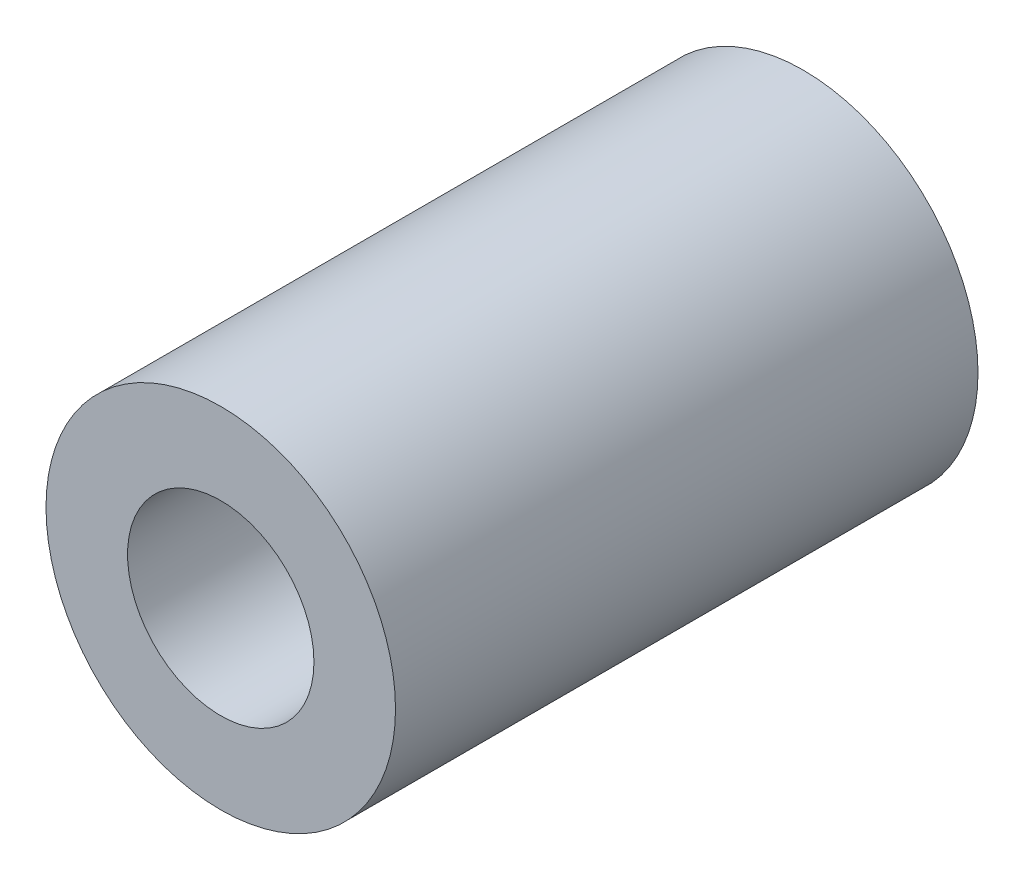
ISO-10303-21;
HEADER;
FILE_DESCRIPTION(('STEP AP214'),'2;1');
FILE_NAME('part.step','',(''),(''),'','','');
FILE_SCHEMA(('AUTOMOTIVE_DESIGN { 1 0 10303 214 1 1 1 1 }'));
ENDSEC;
DATA;
#1=APPLICATION_CONTEXT('core data for automotive mechanical design processes');
#2=APPLICATION_PROTOCOL_DEFINITION('international standard','automotive_design',2000,#1);
#3=PRODUCT_CONTEXT('',#1,'mechanical');
#4=PRODUCT('Part','Part','',(#3));
#5=PRODUCT_RELATED_PRODUCT_CATEGORY('part','',(#4));
#6=PRODUCT_DEFINITION_FORMATION('','',#4);
#7=PRODUCT_DEFINITION_CONTEXT('part definition',#1,'design');
#8=PRODUCT_DEFINITION('design','',#6,#7);
#9=PRODUCT_DEFINITION_SHAPE('','',#8);
#10=(LENGTH_UNIT() NAMED_UNIT(*) SI_UNIT(.MILLI.,.METRE.));
#11=(NAMED_UNIT(*) PLANE_ANGLE_UNIT() SI_UNIT($,.RADIAN.));
#12=(NAMED_UNIT(*) SI_UNIT($,.STERADIAN.) SOLID_ANGLE_UNIT());
#13=UNCERTAINTY_MEASURE_WITH_UNIT(LENGTH_MEASURE(1.E-05),#10,'distance_accuracy_value','');
#14=(GEOMETRIC_REPRESENTATION_CONTEXT(3) GLOBAL_UNCERTAINTY_ASSIGNED_CONTEXT((#13)) GLOBAL_UNIT_ASSIGNED_CONTEXT((#10,
#11,#12)) REPRESENTATION_CONTEXT('',''));
#15=CARTESIAN_POINT('',(0.,0.,0.));
#16=DIRECTION('',(0.,0.,1.));
#17=DIRECTION('',(1.,0.,0.));
#18=AXIS2_PLACEMENT_3D('',#15,#16,#17);
#19=CARTESIAN_POINT('',(0.,0.,12.5));
#20=DIRECTION('',(0.,0.,-1.));
#21=DIRECTION('',(-1.,0.,0.));
#22=AXIS2_PLACEMENT_3D('',#19,#20,#21);
#23=CYLINDRICAL_SURFACE('',#22,7.5);
#24=CARTESIAN_POINT('',(0.,0.,12.5));
#25=DIRECTION('',(0.,0.,1.));
#26=DIRECTION('',(1.,0.,0.));
#27=AXIS2_PLACEMENT_3D('',#24,#25,#26);
#28=CIRCLE('',#27,7.5);
#29=CARTESIAN_POINT('',(7.5,0.,12.5));
#30=VERTEX_POINT('',#29);
#31=EDGE_CURVE('E10',#30,#30,#28,.T.);
#32=ORIENTED_EDGE('',*,*,#31,.F.);
#33=EDGE_LOOP('',(#32));
#34=FACE_BOUND('',#33,.T.);
#35=CARTESIAN_POINT('',(0.,0.,-12.5));
#36=DIRECTION('',(0.,0.,1.));
#37=DIRECTION('',(1.,0.,0.));
#38=AXIS2_PLACEMENT_3D('',#35,#36,#37);
#39=CIRCLE('',#38,7.5);
#40=CARTESIAN_POINT('',(7.5,0.,-12.5));
#41=VERTEX_POINT('',#40);
#42=EDGE_CURVE('E36',#41,#41,#39,.T.);
#43=ORIENTED_EDGE('',*,*,#42,.T.);
#44=EDGE_LOOP('',(#43));
#45=FACE_BOUND('',#44,.T.);
#46=ADVANCED_FACE('F33',(#34,#45),#23,.T.);
#47=CARTESIAN_POINT('',(0.,0.,12.5));
#48=DIRECTION('',(0.,0.,1.));
#49=DIRECTION('',(1.,0.,0.));
#50=AXIS2_PLACEMENT_3D('',#47,#48,#49);
#51=PLANE('',#50);
#52=CARTESIAN_POINT('',(0.,0.,12.5));
#53=DIRECTION('',(0.,0.,1.));
#54=DIRECTION('',(1.,0.,0.));
#55=AXIS2_PLACEMENT_3D('',#52,#53,#54);
#56=CIRCLE('',#55,4.);
#57=CARTESIAN_POINT('',(4.,0.,12.5));
#58=VERTEX_POINT('',#57);
#59=EDGE_CURVE('E51',#58,#58,#56,.T.);
#60=ORIENTED_EDGE('',*,*,#59,.F.);
#61=EDGE_LOOP('',(#60));
#62=FACE_BOUND('',#61,.T.);
#63=ORIENTED_EDGE('',*,*,#31,.T.);
#64=EDGE_LOOP('',(#63));
#65=FACE_BOUND('',#64,.T.);
#66=ADVANCED_FACE('F66',(#62,#65),#51,.T.);
#67=CARTESIAN_POINT('',(0.,0.,-12.5));
#68=DIRECTION('',(0.,0.,1.));
#69=DIRECTION('',(1.,0.,0.));
#70=AXIS2_PLACEMENT_3D('',#67,#68,#69);
#71=PLANE('',#70);
#72=CARTESIAN_POINT('',(0.,0.,-12.5));
#73=DIRECTION('',(0.,0.,-1.));
#74=DIRECTION('',(-1.,0.,0.));
#75=AXIS2_PLACEMENT_3D('',#72,#73,#74);
#76=CIRCLE('',#75,3.);
#77=CARTESIAN_POINT('',(-3.,0.,-12.5));
#78=VERTEX_POINT('',#77);
#79=EDGE_CURVE('E45',#78,#78,#76,.T.);
#80=ORIENTED_EDGE('',*,*,#79,.F.);
#81=EDGE_LOOP('',(#80));
#82=FACE_BOUND('',#81,.T.);
#83=ORIENTED_EDGE('',*,*,#42,.F.);
#84=EDGE_LOOP('',(#83));
#85=FACE_BOUND('',#84,.T.);
#86=ADVANCED_FACE('F68',(#82,#85),#71,.F.);
#87=CARTESIAN_POINT('',(0.,0.,-2.5));
#88=DIRECTION('',(0.,0.,-1.));
#89=DIRECTION('',(-1.,0.,0.));
#90=AXIS2_PLACEMENT_3D('',#87,#88,#89);
#91=CYLINDRICAL_SURFACE('',#90,3.);
#92=CARTESIAN_POINT('',(0.,0.,-2.5));
#93=DIRECTION('',(0.,0.,-1.));
#94=DIRECTION('',(-1.,0.,0.));
#95=AXIS2_PLACEMENT_3D('',#92,#93,#94);
#96=CIRCLE('',#95,3.);
#97=CARTESIAN_POINT('',(-3.,0.,-2.5));
#98=VERTEX_POINT('',#97);
#99=EDGE_CURVE('E43',#98,#98,#96,.T.);
#100=ORIENTED_EDGE('',*,*,#99,.F.);
#101=EDGE_LOOP('',(#100));
#102=FACE_BOUND('',#101,.T.);
#103=ORIENTED_EDGE('',*,*,#79,.T.);
#104=EDGE_LOOP('',(#103));
#105=FACE_BOUND('',#104,.T.);
#106=ADVANCED_FACE('F74',(#102,#105),#91,.F.);
#107=CARTESIAN_POINT('',(0.,0.,-2.5));
#108=DIRECTION('',(0.,0.,-1.));
#109=DIRECTION('',(-1.,0.,0.));
#110=AXIS2_PLACEMENT_3D('',#107,#108,#109);
#111=PLANE('',#110);
#112=ORIENTED_EDGE('',*,*,#99,.T.);
#113=EDGE_LOOP('',(#112));
#114=FACE_BOUND('',#113,.T.);
#115=ADVANCED_FACE('F62',(#114),#111,.T.);
#116=CARTESIAN_POINT('',(0.,0.,3.5));
#117=DIRECTION('',(0.,0.,1.));
#118=DIRECTION('',(1.,0.,0.));
#119=AXIS2_PLACEMENT_3D('',#116,#117,#118);
#120=CYLINDRICAL_SURFACE('',#119,4.);
#121=CARTESIAN_POINT('',(0.,0.,3.5));
#122=DIRECTION('',(0.,0.,1.));
#123=DIRECTION('',(1.,0.,0.));
#124=AXIS2_PLACEMENT_3D('',#121,#122,#123);
#125=CIRCLE('',#124,4.);
#126=CARTESIAN_POINT('',(4.,0.,3.5));
#127=VERTEX_POINT('',#126);
#128=EDGE_CURVE('E48',#127,#127,#125,.T.);
#129=ORIENTED_EDGE('',*,*,#128,.F.);
#130=EDGE_LOOP('',(#129));
#131=FACE_BOUND('',#130,.T.);
#132=ORIENTED_EDGE('',*,*,#59,.T.);
#133=EDGE_LOOP('',(#132));
#134=FACE_BOUND('',#133,.T.);
#135=ADVANCED_FACE('F59',(#131,#134),#120,.F.);
#136=CARTESIAN_POINT('',(0.,0.,3.5));
#137=DIRECTION('',(0.,0.,1.));
#138=DIRECTION('',(1.,0.,0.));
#139=AXIS2_PLACEMENT_3D('',#136,#137,#138);
#140=PLANE('',#139);
#141=ORIENTED_EDGE('',*,*,#128,.T.);
#142=EDGE_LOOP('',(#141));
#143=FACE_BOUND('',#142,.T.);
#144=ADVANCED_FACE('F57',(#143),#140,.T.);
#145=CLOSED_SHELL('',(#46,#66,#86,#106,#115,#135,#144));
#146=MANIFOLD_SOLID_BREP('B2',#145);
#147=ADVANCED_BREP_SHAPE_REPRESENTATION('',(#18,#146),#14);
#148=SHAPE_DEFINITION_REPRESENTATION(#9,#147);
ENDSEC;
END-ISO-10303-21;
